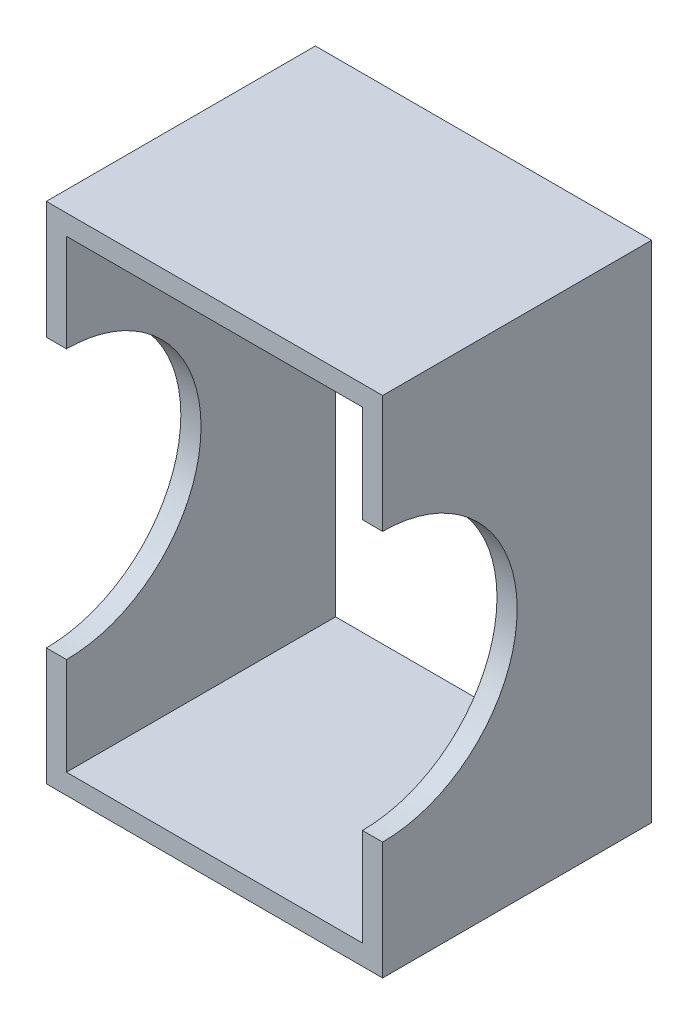
ISO-10303-21;
HEADER;
FILE_DESCRIPTION(('STEP AP214'),'2;1');
FILE_NAME('part.step','',(''),(''),'','','');
FILE_SCHEMA(('AUTOMOTIVE_DESIGN { 1 0 10303 214 1 1 1 1 }'));
ENDSEC;
DATA;
#1=APPLICATION_CONTEXT('core data for automotive mechanical design processes');
#2=APPLICATION_PROTOCOL_DEFINITION('international standard','automotive_design',2000,#1);
#3=PRODUCT_CONTEXT('',#1,'mechanical');
#4=PRODUCT('Part','Part','',(#3));
#5=PRODUCT_RELATED_PRODUCT_CATEGORY('part','',(#4));
#6=PRODUCT_DEFINITION_FORMATION('','',#4);
#7=PRODUCT_DEFINITION_CONTEXT('part definition',#1,'design');
#8=PRODUCT_DEFINITION('design','',#6,#7);
#9=PRODUCT_DEFINITION_SHAPE('','',#8);
#10=(LENGTH_UNIT() NAMED_UNIT(*) SI_UNIT(.MILLI.,.METRE.));
#11=(NAMED_UNIT(*) PLANE_ANGLE_UNIT() SI_UNIT($,.RADIAN.));
#12=(NAMED_UNIT(*) SI_UNIT($,.STERADIAN.) SOLID_ANGLE_UNIT());
#13=UNCERTAINTY_MEASURE_WITH_UNIT(LENGTH_MEASURE(1.E-05),#10,'distance_accuracy_value','');
#14=(GEOMETRIC_REPRESENTATION_CONTEXT(3) GLOBAL_UNCERTAINTY_ASSIGNED_CONTEXT((#13)) GLOBAL_UNIT_ASSIGNED_CONTEXT((#10,
#11,#12)) REPRESENTATION_CONTEXT('',''));
#15=CARTESIAN_POINT('',(0.,0.,0.));
#16=DIRECTION('',(0.,0.,1.));
#17=DIRECTION('',(1.,0.,0.));
#18=AXIS2_PLACEMENT_3D('',#15,#16,#17);
#19=CARTESIAN_POINT('',(0.,0.,0.));
#20=DIRECTION('',(0.,0.,-1.));
#21=DIRECTION('',(-1.,0.,0.));
#22=AXIS2_PLACEMENT_3D('',#19,#20,#21);
#23=PLANE('',#22);
#24=DIRECTION('',(0.,-1.,0.));
#25=VECTOR('',#24,1.);
#26=CARTESIAN_POINT('',(-50.,-75.,0.));
#27=LINE('',#26,#25);
#28=CARTESIAN_POINT('',(-50.,74.9999999999999,0.));
#29=VERTEX_POINT('',#28);
#30=CARTESIAN_POINT('',(-50.,40.,0.));
#31=VERTEX_POINT('',#30);
#32=EDGE_CURVE('E132',#29,#31,#27,.T.);
#33=ORIENTED_EDGE('',*,*,#32,.T.);
#34=DIRECTION('',(1.,0.,0.));
#35=VECTOR('',#34,1.);
#36=CARTESIAN_POINT('',(-50.,40.,0.));
#37=LINE('',#36,#35);
#38=CARTESIAN_POINT('',(-44.,40.,0.));
#39=VERTEX_POINT('',#38);
#40=EDGE_CURVE('E118',#31,#39,#37,.T.);
#41=ORIENTED_EDGE('',*,*,#40,.T.);
#42=DIRECTION('',(0.,-1.,0.));
#43=VECTOR('',#42,1.);
#44=CARTESIAN_POINT('',(-44.,-69.,0.));
#45=LINE('',#44,#43);
#46=CARTESIAN_POINT('',(-44.,69.,0.));
#47=VERTEX_POINT('',#46);
#48=EDGE_CURVE('E197',#47,#39,#45,.T.);
#49=ORIENTED_EDGE('',*,*,#48,.F.);
#50=DIRECTION('',(-1.,0.,0.));
#51=VECTOR('',#50,1.);
#52=CARTESIAN_POINT('',(-44.,69.,0.));
#53=LINE('',#52,#51);
#54=CARTESIAN_POINT('',(44.,69.,0.));
#55=VERTEX_POINT('',#54);
#56=EDGE_CURVE('E186',#55,#47,#53,.T.);
#57=ORIENTED_EDGE('',*,*,#56,.F.);
#58=DIRECTION('',(0.,1.,0.));
#59=VECTOR('',#58,1.);
#60=CARTESIAN_POINT('',(44.,-69.,0.));
#61=LINE('',#60,#59);
#62=CARTESIAN_POINT('',(44.,40.,0.));
#63=VERTEX_POINT('',#62);
#64=EDGE_CURVE('E193',#63,#55,#61,.T.);
#65=ORIENTED_EDGE('',*,*,#64,.F.);
#66=CARTESIAN_POINT('',(50.,40.,0.));
#67=VERTEX_POINT('',#66);
#68=EDGE_CURVE('E55',#63,#67,#37,.T.);
#69=ORIENTED_EDGE('',*,*,#68,.T.);
#70=DIRECTION('',(0.,1.,0.));
#71=VECTOR('',#70,1.);
#72=CARTESIAN_POINT('',(50.,-75.,0.));
#73=LINE('',#72,#71);
#74=CARTESIAN_POINT('',(50.,75.,0.));
#75=VERTEX_POINT('',#74);
#76=EDGE_CURVE('E144',#67,#75,#73,.T.);
#77=ORIENTED_EDGE('',*,*,#76,.T.);
#78=DIRECTION('',(-1.,0.,0.));
#79=VECTOR('',#78,1.);
#80=CARTESIAN_POINT('',(-50.,74.9999999999999,0.));
#81=LINE('',#80,#79);
#82=EDGE_CURVE('E140',#75,#29,#81,.T.);
#83=ORIENTED_EDGE('',*,*,#82,.T.);
#84=EDGE_LOOP('',(#33,#41,#49,#57,#65,#69,#77,#83));
#85=FACE_BOUND('',#84,.T.);
#86=ADVANCED_FACE('F32',(#85),#23,.F.);
#87=CARTESIAN_POINT('',(-50.,-75.,-80.));
#88=DIRECTION('',(-1.,0.,0.));
#89=DIRECTION('',(0.,-1.,0.));
#90=AXIS2_PLACEMENT_3D('',#87,#88,#89);
#91=PLANE('',#90);
#92=CARTESIAN_POINT('',(-50.,0.,0.));
#93=DIRECTION('',(1.,0.,0.));
#94=DIRECTION('',(0.,0.,-1.));
#95=AXIS2_PLACEMENT_3D('',#92,#93,#94);
#96=CIRCLE('',#95,40.);
#97=CARTESIAN_POINT('',(-50.,-40.,0.));
#98=VERTEX_POINT('',#97);
#99=EDGE_CURVE('E121',#98,#31,#96,.T.);
#100=ORIENTED_EDGE('',*,*,#99,.T.);
#101=ORIENTED_EDGE('',*,*,#32,.F.);
#102=DIRECTION('',(0.,0.,1.));
#103=VECTOR('',#102,1.);
#104=CARTESIAN_POINT('',(-50.,74.9999999999999,-80.));
#105=LINE('',#104,#103);
#106=CARTESIAN_POINT('',(-50.,74.9999999999999,-80.));
#107=VERTEX_POINT('',#106);
#108=EDGE_CURVE('E40',#107,#29,#105,.T.);
#109=ORIENTED_EDGE('',*,*,#108,.F.);
#110=DIRECTION('',(0.,-1.,0.));
#111=VECTOR('',#110,1.);
#112=CARTESIAN_POINT('',(-50.,-75.,-80.));
#113=LINE('',#112,#111);
#114=CARTESIAN_POINT('',(-50.,-75.,-80.));
#115=VERTEX_POINT('',#114);
#116=EDGE_CURVE('E155',#107,#115,#113,.T.);
#117=ORIENTED_EDGE('',*,*,#116,.T.);
#118=DIRECTION('',(0.,0.,1.));
#119=VECTOR('',#118,1.);
#120=CARTESIAN_POINT('',(-50.,-75.,-80.));
#121=LINE('',#120,#119);
#122=CARTESIAN_POINT('',(-50.,-75.,0.));
#123=VERTEX_POINT('',#122);
#124=EDGE_CURVE('E161',#115,#123,#121,.T.);
#125=ORIENTED_EDGE('',*,*,#124,.T.);
#126=EDGE_CURVE('E135',#98,#123,#27,.T.);
#127=ORIENTED_EDGE('',*,*,#126,.F.);
#128=EDGE_LOOP('',(#100,#101,#109,#117,#125,#127));
#129=FACE_BOUND('',#128,.T.);
#130=ADVANCED_FACE('F34',(#129),#91,.T.);
#131=CARTESIAN_POINT('',(-50.,74.9999999999999,-80.));
#132=DIRECTION('',(0.,1.,0.));
#133=DIRECTION('',(-1.,0.,0.));
#134=AXIS2_PLACEMENT_3D('',#131,#132,#133);
#135=PLANE('',#134);
#136=ORIENTED_EDGE('',*,*,#82,.F.);
#137=DIRECTION('',(0.,0.,1.));
#138=VECTOR('',#137,1.);
#139=CARTESIAN_POINT('',(50.,75.,-80.));
#140=LINE('',#139,#138);
#141=CARTESIAN_POINT('',(50.,75.,-80.));
#142=VERTEX_POINT('',#141);
#143=EDGE_CURVE('E157',#142,#75,#140,.T.);
#144=ORIENTED_EDGE('',*,*,#143,.F.);
#145=DIRECTION('',(-1.,0.,0.));
#146=VECTOR('',#145,1.);
#147=CARTESIAN_POINT('',(-50.,74.9999999999999,-80.));
#148=LINE('',#147,#146);
#149=EDGE_CURVE('E148',#142,#107,#148,.T.);
#150=ORIENTED_EDGE('',*,*,#149,.T.);
#151=ORIENTED_EDGE('',*,*,#108,.T.);
#152=EDGE_LOOP('',(#136,#144,#150,#151));
#153=FACE_BOUND('',#152,.T.);
#154=ADVANCED_FACE('F219',(#153),#135,.T.);
#155=CARTESIAN_POINT('',(50.,-75.,-80.));
#156=DIRECTION('',(1.,0.,0.));
#157=DIRECTION('',(0.,1.,0.));
#158=AXIS2_PLACEMENT_3D('',#155,#156,#157);
#159=PLANE('',#158);
#160=CARTESIAN_POINT('',(50.,0.,0.));
#161=DIRECTION('',(1.,0.,0.));
#162=DIRECTION('',(0.,0.,-1.));
#163=AXIS2_PLACEMENT_3D('',#160,#161,#162);
#164=CIRCLE('',#163,40.);
#165=CARTESIAN_POINT('',(50.,-40.,0.));
#166=VERTEX_POINT('',#165);
#167=EDGE_CURVE('E137',#166,#67,#164,.T.);
#168=ORIENTED_EDGE('',*,*,#167,.F.);
#169=CARTESIAN_POINT('',(50.,-75.,0.));
#170=VERTEX_POINT('',#169);
#171=EDGE_CURVE('E151',#170,#166,#73,.T.);
#172=ORIENTED_EDGE('',*,*,#171,.F.);
#173=DIRECTION('',(0.,0.,1.));
#174=VECTOR('',#173,1.);
#175=CARTESIAN_POINT('',(50.,-75.,-80.));
#176=LINE('',#175,#174);
#177=CARTESIAN_POINT('',(50.,-75.,-80.));
#178=VERTEX_POINT('',#177);
#179=EDGE_CURVE('E160',#178,#170,#176,.T.);
#180=ORIENTED_EDGE('',*,*,#179,.F.);
#181=DIRECTION('',(0.,1.,0.));
#182=VECTOR('',#181,1.);
#183=CARTESIAN_POINT('',(50.,-75.,-80.));
#184=LINE('',#183,#182);
#185=EDGE_CURVE('E165',#178,#142,#184,.T.);
#186=ORIENTED_EDGE('',*,*,#185,.T.);
#187=ORIENTED_EDGE('',*,*,#143,.T.);
#188=ORIENTED_EDGE('',*,*,#76,.F.);
#189=EDGE_LOOP('',(#168,#172,#180,#186,#187,#188));
#190=FACE_BOUND('',#189,.T.);
#191=ADVANCED_FACE('F218',(#190),#159,.T.);
#192=CARTESIAN_POINT('',(-50.,-75.,-80.));
#193=DIRECTION('',(0.,-1.,0.));
#194=DIRECTION('',(0.,0.,-1.));
#195=AXIS2_PLACEMENT_3D('',#192,#193,#194);
#196=PLANE('',#195);
#197=DIRECTION('',(1.,0.,0.));
#198=VECTOR('',#197,1.);
#199=CARTESIAN_POINT('',(-50.,-75.,0.));
#200=LINE('',#199,#198);
#201=EDGE_CURVE('E141',#123,#170,#200,.T.);
#202=ORIENTED_EDGE('',*,*,#201,.F.);
#203=ORIENTED_EDGE('',*,*,#124,.F.);
#204=DIRECTION('',(1.,0.,0.));
#205=VECTOR('',#204,1.);
#206=CARTESIAN_POINT('',(-50.,-75.,-80.));
#207=LINE('',#206,#205);
#208=EDGE_CURVE('E169',#115,#178,#207,.T.);
#209=ORIENTED_EDGE('',*,*,#208,.T.);
#210=ORIENTED_EDGE('',*,*,#179,.T.);
#211=EDGE_LOOP('',(#202,#203,#209,#210));
#212=FACE_BOUND('',#211,.T.);
#213=ADVANCED_FACE('F225',(#212),#196,.T.);
#214=CARTESIAN_POINT('',(0.,0.,-80.));
#215=DIRECTION('',(0.,0.,-1.));
#216=DIRECTION('',(-1.,0.,0.));
#217=AXIS2_PLACEMENT_3D('',#214,#215,#216);
#218=PLANE('',#217);
#219=DIRECTION('',(0.,-1.,0.));
#220=VECTOR('',#219,1.);
#221=CARTESIAN_POINT('',(-44.,-69.,-80.));
#222=LINE('',#221,#220);
#223=CARTESIAN_POINT('',(-44.,69.,-80.));
#224=VERTEX_POINT('',#223);
#225=CARTESIAN_POINT('',(-44.,-69.,-80.));
#226=VERTEX_POINT('',#225);
#227=EDGE_CURVE('E189',#224,#226,#222,.T.);
#228=ORIENTED_EDGE('',*,*,#227,.T.);
#229=DIRECTION('',(1.,0.,0.));
#230=VECTOR('',#229,1.);
#231=CARTESIAN_POINT('',(-44.,-69.,-80.));
#232=LINE('',#231,#230);
#233=CARTESIAN_POINT('',(44.,-69.,-80.));
#234=VERTEX_POINT('',#233);
#235=EDGE_CURVE('E204',#226,#234,#232,.T.);
#236=ORIENTED_EDGE('',*,*,#235,.T.);
#237=DIRECTION('',(0.,1.,0.));
#238=VECTOR('',#237,1.);
#239=CARTESIAN_POINT('',(44.,-69.,-80.));
#240=LINE('',#239,#238);
#241=CARTESIAN_POINT('',(44.,69.,-80.));
#242=VERTEX_POINT('',#241);
#243=EDGE_CURVE('E201',#234,#242,#240,.T.);
#244=ORIENTED_EDGE('',*,*,#243,.T.);
#245=DIRECTION('',(-1.,0.,0.));
#246=VECTOR('',#245,1.);
#247=CARTESIAN_POINT('',(-44.,69.,-80.));
#248=LINE('',#247,#246);
#249=EDGE_CURVE('E180',#242,#224,#248,.T.);
#250=ORIENTED_EDGE('',*,*,#249,.T.);
#251=EDGE_LOOP('',(#228,#236,#244,#250));
#252=FACE_BOUND('',#251,.T.);
#253=ORIENTED_EDGE('',*,*,#116,.F.);
#254=ORIENTED_EDGE('',*,*,#149,.F.);
#255=ORIENTED_EDGE('',*,*,#185,.F.);
#256=ORIENTED_EDGE('',*,*,#208,.F.);
#257=EDGE_LOOP('',(#253,#254,#255,#256));
#258=FACE_BOUND('',#257,.T.);
#259=ADVANCED_FACE('F223',(#252,#258),#218,.T.);
#260=ORIENTED_EDGE('',*,*,#171,.T.);
#261=DIRECTION('',(1.,0.,0.));
#262=VECTOR('',#261,1.);
#263=CARTESIAN_POINT('',(-50.,-40.,0.));
#264=LINE('',#263,#262);
#265=CARTESIAN_POINT('',(44.,-40.,0.));
#266=VERTEX_POINT('',#265);
#267=EDGE_CURVE('E136',#166,#266,#264,.F.);
#268=ORIENTED_EDGE('',*,*,#267,.T.);
#269=CARTESIAN_POINT('',(44.,-69.,0.));
#270=VERTEX_POINT('',#269);
#271=EDGE_CURVE('E190',#270,#266,#61,.T.);
#272=ORIENTED_EDGE('',*,*,#271,.F.);
#273=DIRECTION('',(1.,0.,0.));
#274=VECTOR('',#273,1.);
#275=CARTESIAN_POINT('',(-44.,-69.,0.));
#276=LINE('',#275,#274);
#277=CARTESIAN_POINT('',(-44.,-69.,0.));
#278=VERTEX_POINT('',#277);
#279=EDGE_CURVE('E194',#278,#270,#276,.T.);
#280=ORIENTED_EDGE('',*,*,#279,.F.);
#281=CARTESIAN_POINT('',(-44.,-40.,0.));
#282=VERTEX_POINT('',#281);
#283=EDGE_CURVE('E127',#282,#278,#45,.T.);
#284=ORIENTED_EDGE('',*,*,#283,.F.);
#285=EDGE_CURVE('E47',#282,#98,#264,.F.);
#286=ORIENTED_EDGE('',*,*,#285,.T.);
#287=ORIENTED_EDGE('',*,*,#126,.T.);
#288=ORIENTED_EDGE('',*,*,#201,.T.);
#289=EDGE_LOOP('',(#260,#268,#272,#280,#284,#286,#287,#288));
#290=FACE_BOUND('',#289,.T.);
#291=ADVANCED_FACE('F227',(#290),#23,.F.);
#292=CARTESIAN_POINT('',(-44.,-69.,-80.));
#293=DIRECTION('',(-1.,0.,0.));
#294=DIRECTION('',(0.,0.,1.));
#295=AXIS2_PLACEMENT_3D('',#292,#293,#294);
#296=PLANE('',#295);
#297=ORIENTED_EDGE('',*,*,#48,.T.);
#298=CARTESIAN_POINT('',(-44.,0.,0.));
#299=DIRECTION('',(-1.,0.,0.));
#300=DIRECTION('',(0.,0.,1.));
#301=AXIS2_PLACEMENT_3D('',#298,#299,#300);
#302=CIRCLE('',#301,40.);
#303=EDGE_CURVE('E122',#39,#282,#302,.T.);
#304=ORIENTED_EDGE('',*,*,#303,.T.);
#305=ORIENTED_EDGE('',*,*,#283,.T.);
#306=DIRECTION('',(0.,0.,1.));
#307=VECTOR('',#306,1.);
#308=CARTESIAN_POINT('',(-44.,-69.,-80.));
#309=LINE('',#308,#307);
#310=EDGE_CURVE('E176',#226,#278,#309,.T.);
#311=ORIENTED_EDGE('',*,*,#310,.F.);
#312=ORIENTED_EDGE('',*,*,#227,.F.);
#313=DIRECTION('',(0.,0.,1.));
#314=VECTOR('',#313,1.);
#315=CARTESIAN_POINT('',(-44.,69.,-80.));
#316=LINE('',#315,#314);
#317=EDGE_CURVE('E146',#224,#47,#316,.T.);
#318=ORIENTED_EDGE('',*,*,#317,.T.);
#319=EDGE_LOOP('',(#297,#304,#305,#311,#312,#318));
#320=FACE_BOUND('',#319,.T.);
#321=ADVANCED_FACE('F232',(#320),#296,.F.);
#322=CARTESIAN_POINT('',(-44.,69.,-80.));
#323=DIRECTION('',(0.,1.,0.));
#324=DIRECTION('',(0.,0.,1.));
#325=AXIS2_PLACEMENT_3D('',#322,#323,#324);
#326=PLANE('',#325);
#327=ORIENTED_EDGE('',*,*,#56,.T.);
#328=ORIENTED_EDGE('',*,*,#317,.F.);
#329=ORIENTED_EDGE('',*,*,#249,.F.);
#330=DIRECTION('',(0.,0.,1.));
#331=VECTOR('',#330,1.);
#332=CARTESIAN_POINT('',(44.,69.,-80.));
#333=LINE('',#332,#331);
#334=EDGE_CURVE('E182',#242,#55,#333,.T.);
#335=ORIENTED_EDGE('',*,*,#334,.T.);
#336=EDGE_LOOP('',(#327,#328,#329,#335));
#337=FACE_BOUND('',#336,.T.);
#338=ADVANCED_FACE('F241',(#337),#326,.F.);
#339=CARTESIAN_POINT('',(44.,-69.,-80.));
#340=DIRECTION('',(1.,0.,0.));
#341=DIRECTION('',(0.,0.,-1.));
#342=AXIS2_PLACEMENT_3D('',#339,#340,#341);
#343=PLANE('',#342);
#344=ORIENTED_EDGE('',*,*,#271,.T.);
#345=CARTESIAN_POINT('',(44.,0.,0.));
#346=DIRECTION('',(1.,0.,0.));
#347=DIRECTION('',(0.,0.,-1.));
#348=AXIS2_PLACEMENT_3D('',#345,#346,#347);
#349=CIRCLE('',#348,40.);
#350=EDGE_CURVE('E11',#266,#63,#349,.T.);
#351=ORIENTED_EDGE('',*,*,#350,.T.);
#352=ORIENTED_EDGE('',*,*,#64,.T.);
#353=ORIENTED_EDGE('',*,*,#334,.F.);
#354=ORIENTED_EDGE('',*,*,#243,.F.);
#355=DIRECTION('',(0.,0.,1.));
#356=VECTOR('',#355,1.);
#357=CARTESIAN_POINT('',(44.,-69.,-80.));
#358=LINE('',#357,#356);
#359=EDGE_CURVE('E179',#234,#270,#358,.T.);
#360=ORIENTED_EDGE('',*,*,#359,.T.);
#361=EDGE_LOOP('',(#344,#351,#352,#353,#354,#360));
#362=FACE_BOUND('',#361,.T.);
#363=ADVANCED_FACE('F243',(#362),#343,.F.);
#364=CARTESIAN_POINT('',(-44.,-69.,-80.));
#365=DIRECTION('',(0.,-1.,0.));
#366=DIRECTION('',(0.,0.,-1.));
#367=AXIS2_PLACEMENT_3D('',#364,#365,#366);
#368=PLANE('',#367);
#369=ORIENTED_EDGE('',*,*,#279,.T.);
#370=ORIENTED_EDGE('',*,*,#359,.F.);
#371=ORIENTED_EDGE('',*,*,#235,.F.);
#372=ORIENTED_EDGE('',*,*,#310,.T.);
#373=EDGE_LOOP('',(#369,#370,#371,#372));
#374=FACE_BOUND('',#373,.T.);
#375=ADVANCED_FACE('F236',(#374),#368,.F.);
#376=CARTESIAN_POINT('',(-50.,0.,0.));
#377=DIRECTION('',(1.,0.,0.));
#378=DIRECTION('',(0.,0.,-1.));
#379=AXIS2_PLACEMENT_3D('',#376,#377,#378);
#380=CYLINDRICAL_SURFACE('',#379,40.);
#381=ORIENTED_EDGE('',*,*,#350,.F.);
#382=ORIENTED_EDGE('',*,*,#267,.F.);
#383=ORIENTED_EDGE('',*,*,#167,.T.);
#384=ORIENTED_EDGE('',*,*,#68,.F.);
#385=EDGE_LOOP('',(#381,#382,#383,#384));
#386=FACE_BOUND('',#385,.T.);
#387=ADVANCED_FACE('F213',(#386),#380,.F.);
#388=ORIENTED_EDGE('',*,*,#99,.F.);
#389=ORIENTED_EDGE('',*,*,#285,.F.);
#390=ORIENTED_EDGE('',*,*,#303,.F.);
#391=ORIENTED_EDGE('',*,*,#40,.F.);
#392=EDGE_LOOP('',(#388,#389,#390,#391));
#393=FACE_BOUND('',#392,.T.);
#394=ADVANCED_FACE('F120',(#393),#380,.F.);
#395=CLOSED_SHELL('',(#86,#130,#154,#191,#213,#259,#291,#321,#338,#363,#375,#387,#394));
#396=MANIFOLD_SOLID_BREP('B2',#395);
#397=ADVANCED_BREP_SHAPE_REPRESENTATION('',(#18,#396),#14);
#398=SHAPE_DEFINITION_REPRESENTATION(#9,#397);
ENDSEC;
END-ISO-10303-21;
